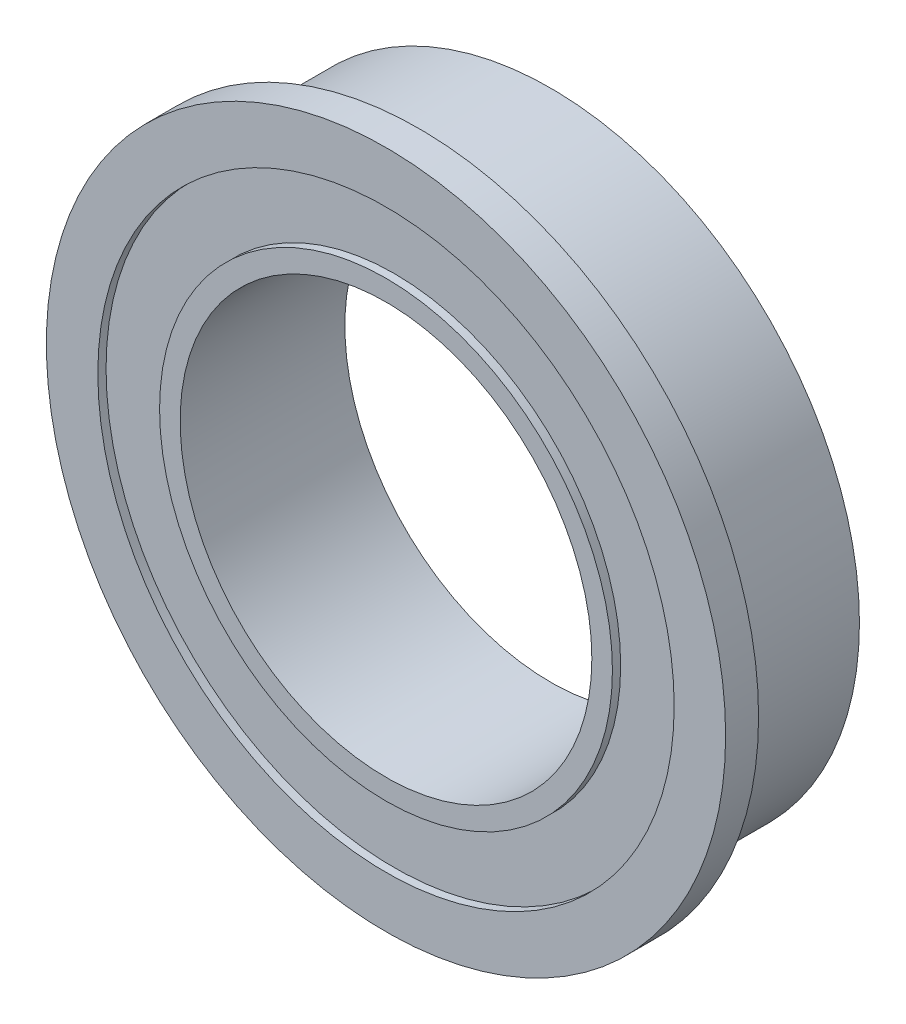
ISO-10303-21;
HEADER;
FILE_DESCRIPTION(('STEP AP214'),'2;1');
FILE_NAME('part.step','',(''),(''),'','','');
FILE_SCHEMA(('AUTOMOTIVE_DESIGN { 1 0 10303 214 1 1 1 1 }'));
ENDSEC;
DATA;
#1=APPLICATION_CONTEXT('core data for automotive mechanical design processes');
#2=APPLICATION_PROTOCOL_DEFINITION('international standard','automotive_design',2000,#1);
#3=PRODUCT_CONTEXT('',#1,'mechanical');
#4=PRODUCT('Part','Part','',(#3));
#5=PRODUCT_RELATED_PRODUCT_CATEGORY('part','',(#4));
#6=PRODUCT_DEFINITION_FORMATION('','',#4);
#7=PRODUCT_DEFINITION_CONTEXT('part definition',#1,'design');
#8=PRODUCT_DEFINITION('design','',#6,#7);
#9=PRODUCT_DEFINITION_SHAPE('','',#8);
#10=(LENGTH_UNIT() NAMED_UNIT(*) SI_UNIT(.MILLI.,.METRE.));
#11=(NAMED_UNIT(*) PLANE_ANGLE_UNIT() SI_UNIT($,.RADIAN.));
#12=(NAMED_UNIT(*) SI_UNIT($,.STERADIAN.) SOLID_ANGLE_UNIT());
#13=UNCERTAINTY_MEASURE_WITH_UNIT(LENGTH_MEASURE(1.E-05),#10,'distance_accuracy_value','');
#14=(GEOMETRIC_REPRESENTATION_CONTEXT(3) GLOBAL_UNCERTAINTY_ASSIGNED_CONTEXT((#13)) GLOBAL_UNIT_ASSIGNED_CONTEXT((#10,
#11,#12)) REPRESENTATION_CONTEXT('',''));
#15=CARTESIAN_POINT('',(0.,0.,0.));
#16=DIRECTION('',(0.,0.,1.));
#17=DIRECTION('',(1.,0.,0.));
#18=AXIS2_PLACEMENT_3D('',#15,#16,#17);
#19=CARTESIAN_POINT('',(0.,0.,0.8));
#20=DIRECTION('',(0.,0.,1.));
#21=DIRECTION('',(1.,0.,0.));
#22=AXIS2_PLACEMENT_3D('',#19,#20,#21);
#23=PLANE('',#22);
#24=CARTESIAN_POINT('',(0.,0.,0.8));
#25=DIRECTION('',(0.,0.,1.));
#26=DIRECTION('',(1.,0.,0.));
#27=AXIS2_PLACEMENT_3D('',#24,#25,#26);
#28=CIRCLE('',#27,5.);
#29=CARTESIAN_POINT('',(5.,0.,0.8));
#30=VERTEX_POINT('',#29);
#31=EDGE_CURVE('E53',#30,#30,#28,.T.);
#32=ORIENTED_EDGE('',*,*,#31,.F.);
#33=EDGE_LOOP('',(#32));
#34=FACE_BOUND('',#33,.T.);
#35=CARTESIAN_POINT('',(0.,0.,0.8));
#36=DIRECTION('',(0.,0.,-1.));
#37=DIRECTION('',(-1.,0.,0.));
#38=AXIS2_PLACEMENT_3D('',#35,#36,#37);
#39=CIRCLE('',#38,5.5);
#40=CARTESIAN_POINT('',(-5.5,0.,0.8));
#41=VERTEX_POINT('',#40);
#42=EDGE_CURVE('E77',#41,#41,#39,.T.);
#43=ORIENTED_EDGE('',*,*,#42,.F.);
#44=EDGE_LOOP('',(#43));
#45=FACE_BOUND('',#44,.T.);
#46=ADVANCED_FACE('F34',(#34,#45),#23,.T.);
#47=CARTESIAN_POINT('',(0.,0.,-3.2));
#48=DIRECTION('',(0.,0.,1.));
#49=DIRECTION('',(1.,0.,0.));
#50=AXIS2_PLACEMENT_3D('',#47,#48,#49);
#51=PLANE('',#50);
#52=CARTESIAN_POINT('',(0.,0.,-3.2));
#53=DIRECTION('',(0.,0.,1.));
#54=DIRECTION('',(1.,0.,0.));
#55=AXIS2_PLACEMENT_3D('',#52,#53,#54);
#56=CIRCLE('',#55,5.);
#57=CARTESIAN_POINT('',(5.,0.,-3.2));
#58=VERTEX_POINT('',#57);
#59=EDGE_CURVE('E52',#58,#58,#56,.T.);
#60=ORIENTED_EDGE('',*,*,#59,.T.);
#61=EDGE_LOOP('',(#60));
#62=FACE_BOUND('',#61,.T.);
#63=CARTESIAN_POINT('',(0.,0.,-3.2));
#64=DIRECTION('',(0.,0.,-1.));
#65=DIRECTION('',(-1.,0.,0.));
#66=AXIS2_PLACEMENT_3D('',#63,#64,#65);
#67=CIRCLE('',#66,5.5);
#68=CARTESIAN_POINT('',(-5.5,0.,-3.2));
#69=VERTEX_POINT('',#68);
#70=EDGE_CURVE('E65',#69,#69,#67,.T.);
#71=ORIENTED_EDGE('',*,*,#70,.T.);
#72=EDGE_LOOP('',(#71));
#73=FACE_BOUND('',#72,.T.);
#74=ADVANCED_FACE('F93',(#62,#73),#51,.F.);
#75=CARTESIAN_POINT('',(0.,0.,0.8));
#76=DIRECTION('',(0.,0.,-1.));
#77=DIRECTION('',(-1.,0.,0.));
#78=AXIS2_PLACEMENT_3D('',#75,#76,#77);
#79=CIRCLE('',#78,7.);
#80=CARTESIAN_POINT('',(-7.,0.,0.8));
#81=VERTEX_POINT('',#80);
#82=EDGE_CURVE('E71',#81,#81,#79,.T.);
#83=ORIENTED_EDGE('',*,*,#82,.T.);
#84=EDGE_LOOP('',(#83));
#85=FACE_BOUND('',#84,.T.);
#86=CARTESIAN_POINT('',(0.,0.,0.8));
#87=DIRECTION('',(0.,0.,1.));
#88=DIRECTION('',(1.,0.,0.));
#89=AXIS2_PLACEMENT_3D('',#86,#87,#88);
#90=CIRCLE('',#89,8.25);
#91=CARTESIAN_POINT('',(8.25,0.,0.8));
#92=VERTEX_POINT('',#91);
#93=EDGE_CURVE('E10',#92,#92,#90,.T.);
#94=ORIENTED_EDGE('',*,*,#93,.T.);
#95=EDGE_LOOP('',(#94));
#96=FACE_BOUND('',#95,.T.);
#97=ADVANCED_FACE('F96',(#85,#96),#23,.T.);
#98=CARTESIAN_POINT('',(0.,0.,0.));
#99=DIRECTION('',(0.,0.,1.));
#100=DIRECTION('',(1.,0.,0.));
#101=AXIS2_PLACEMENT_3D('',#98,#99,#100);
#102=PLANE('',#101);
#103=CARTESIAN_POINT('',(0.,0.,0.));
#104=DIRECTION('',(0.,0.,1.));
#105=DIRECTION('',(1.,0.,0.));
#106=AXIS2_PLACEMENT_3D('',#103,#104,#105);
#107=CIRCLE('',#106,8.25);
#108=CARTESIAN_POINT('',(8.25,0.,0.));
#109=VERTEX_POINT('',#108);
#110=EDGE_CURVE('E38',#109,#109,#107,.T.);
#111=ORIENTED_EDGE('',*,*,#110,.F.);
#112=EDGE_LOOP('',(#111));
#113=FACE_BOUND('',#112,.T.);
#114=CARTESIAN_POINT('',(0.,0.,0.));
#115=DIRECTION('',(0.,0.,1.));
#116=DIRECTION('',(1.,0.,0.));
#117=AXIS2_PLACEMENT_3D('',#114,#115,#116);
#118=CIRCLE('',#117,7.5);
#119=CARTESIAN_POINT('',(7.5,0.,0.));
#120=VERTEX_POINT('',#119);
#121=EDGE_CURVE('E45',#120,#120,#118,.T.);
#122=ORIENTED_EDGE('',*,*,#121,.T.);
#123=EDGE_LOOP('',(#122));
#124=FACE_BOUND('',#123,.T.);
#125=ADVANCED_FACE('F106',(#113,#124),#102,.F.);
#126=CARTESIAN_POINT('',(0.,0.,0.8));
#127=DIRECTION('',(0.,0.,-1.));
#128=DIRECTION('',(-1.,0.,0.));
#129=AXIS2_PLACEMENT_3D('',#126,#127,#128);
#130=CYLINDRICAL_SURFACE('',#129,8.25);
#131=ORIENTED_EDGE('',*,*,#93,.F.);
#132=EDGE_LOOP('',(#131));
#133=FACE_BOUND('',#132,.T.);
#134=ORIENTED_EDGE('',*,*,#110,.T.);
#135=EDGE_LOOP('',(#134));
#136=FACE_BOUND('',#135,.T.);
#137=ADVANCED_FACE('F36',(#133,#136),#130,.T.);
#138=CARTESIAN_POINT('',(0.,0.,-3.2));
#139=DIRECTION('',(0.,0.,1.));
#140=DIRECTION('',(1.,0.,0.));
#141=AXIS2_PLACEMENT_3D('',#138,#139,#140);
#142=CYLINDRICAL_SURFACE('',#141,7.5);
#143=CARTESIAN_POINT('',(0.,0.,-3.2));
#144=DIRECTION('',(0.,0.,1.));
#145=DIRECTION('',(1.,0.,0.));
#146=AXIS2_PLACEMENT_3D('',#143,#144,#145);
#147=CIRCLE('',#146,7.5);
#148=CARTESIAN_POINT('',(7.5,0.,-3.2));
#149=VERTEX_POINT('',#148);
#150=EDGE_CURVE('E49',#149,#149,#147,.T.);
#151=ORIENTED_EDGE('',*,*,#150,.T.);
#152=EDGE_LOOP('',(#151));
#153=FACE_BOUND('',#152,.T.);
#154=ORIENTED_EDGE('',*,*,#121,.F.);
#155=EDGE_LOOP('',(#154));
#156=FACE_BOUND('',#155,.T.);
#157=ADVANCED_FACE('F139',(#153,#156),#142,.T.);
#158=CARTESIAN_POINT('',(0.,0.,-3.2));
#159=DIRECTION('',(0.,0.,-1.));
#160=DIRECTION('',(-1.,0.,0.));
#161=AXIS2_PLACEMENT_3D('',#158,#159,#160);
#162=CIRCLE('',#161,7.);
#163=CARTESIAN_POINT('',(-7.,0.,-3.2));
#164=VERTEX_POINT('',#163);
#165=EDGE_CURVE('E59',#164,#164,#162,.T.);
#166=ORIENTED_EDGE('',*,*,#165,.F.);
#167=EDGE_LOOP('',(#166));
#168=FACE_BOUND('',#167,.T.);
#169=ORIENTED_EDGE('',*,*,#150,.F.);
#170=EDGE_LOOP('',(#169));
#171=FACE_BOUND('',#170,.T.);
#172=ADVANCED_FACE('F102',(#168,#171),#51,.F.);
#173=CARTESIAN_POINT('',(0.,0.,-3.2));
#174=DIRECTION('',(0.,0.,1.));
#175=DIRECTION('',(1.,0.,0.));
#176=AXIS2_PLACEMENT_3D('',#173,#174,#175);
#177=CYLINDRICAL_SURFACE('',#176,5.);
#178=ORIENTED_EDGE('',*,*,#59,.F.);
#179=EDGE_LOOP('',(#178));
#180=FACE_BOUND('',#179,.T.);
#181=ORIENTED_EDGE('',*,*,#31,.T.);
#182=EDGE_LOOP('',(#181));
#183=FACE_BOUND('',#182,.T.);
#184=ADVANCED_FACE('F134',(#180,#183),#177,.F.);
#185=CARTESIAN_POINT('',(0.,0.,-3.));
#186=DIRECTION('',(0.,0.,-1.));
#187=DIRECTION('',(-1.,0.,0.));
#188=AXIS2_PLACEMENT_3D('',#185,#186,#187);
#189=CYLINDRICAL_SURFACE('',#188,7.);
#190=CARTESIAN_POINT('',(0.,0.,-3.));
#191=DIRECTION('',(0.,0.,-1.));
#192=DIRECTION('',(-1.,0.,0.));
#193=AXIS2_PLACEMENT_3D('',#190,#191,#192);
#194=CIRCLE('',#193,7.);
#195=CARTESIAN_POINT('',(-7.,0.,-3.));
#196=VERTEX_POINT('',#195);
#197=EDGE_CURVE('E56',#196,#196,#194,.T.);
#198=ORIENTED_EDGE('',*,*,#197,.F.);
#199=EDGE_LOOP('',(#198));
#200=FACE_BOUND('',#199,.T.);
#201=ORIENTED_EDGE('',*,*,#165,.T.);
#202=EDGE_LOOP('',(#201));
#203=FACE_BOUND('',#202,.T.);
#204=ADVANCED_FACE('F130',(#200,#203),#189,.F.);
#205=CARTESIAN_POINT('',(0.,0.,-3.));
#206=DIRECTION('',(0.,0.,-1.));
#207=DIRECTION('',(-1.,0.,0.));
#208=AXIS2_PLACEMENT_3D('',#205,#206,#207);
#209=PLANE('',#208);
#210=CARTESIAN_POINT('',(0.,0.,-3.));
#211=DIRECTION('',(0.,0.,-1.));
#212=DIRECTION('',(-1.,0.,0.));
#213=AXIS2_PLACEMENT_3D('',#210,#211,#212);
#214=CIRCLE('',#213,5.5);
#215=CARTESIAN_POINT('',(-5.5,0.,-3.));
#216=VERTEX_POINT('',#215);
#217=EDGE_CURVE('E62',#216,#216,#214,.T.);
#218=ORIENTED_EDGE('',*,*,#217,.F.);
#219=EDGE_LOOP('',(#218));
#220=FACE_BOUND('',#219,.T.);
#221=ORIENTED_EDGE('',*,*,#197,.T.);
#222=EDGE_LOOP('',(#221));
#223=FACE_BOUND('',#222,.T.);
#224=ADVANCED_FACE('F126',(#220,#223),#209,.T.);
#225=CARTESIAN_POINT('',(0.,0.,-3.));
#226=DIRECTION('',(0.,0.,-1.));
#227=DIRECTION('',(-1.,0.,0.));
#228=AXIS2_PLACEMENT_3D('',#225,#226,#227);
#229=CYLINDRICAL_SURFACE('',#228,5.5);
#230=ORIENTED_EDGE('',*,*,#217,.T.);
#231=EDGE_LOOP('',(#230));
#232=FACE_BOUND('',#231,.T.);
#233=ORIENTED_EDGE('',*,*,#70,.F.);
#234=EDGE_LOOP('',(#233));
#235=FACE_BOUND('',#234,.T.);
#236=ADVANCED_FACE('F120',(#232,#235),#229,.T.);
#237=CARTESIAN_POINT('',(0.,0.,0.6));
#238=DIRECTION('',(0.,0.,1.));
#239=DIRECTION('',(-1.,0.,0.));
#240=AXIS2_PLACEMENT_3D('',#237,#238,#239);
#241=PLANE('',#240);
#242=CARTESIAN_POINT('',(0.,0.,0.6));
#243=DIRECTION('',(0.,0.,-1.));
#244=DIRECTION('',(-1.,0.,0.));
#245=AXIS2_PLACEMENT_3D('',#242,#243,#244);
#246=CIRCLE('',#245,7.);
#247=CARTESIAN_POINT('',(-7.,0.,0.6));
#248=VERTEX_POINT('',#247);
#249=EDGE_CURVE('E68',#248,#248,#246,.T.);
#250=ORIENTED_EDGE('',*,*,#249,.F.);
#251=EDGE_LOOP('',(#250));
#252=FACE_BOUND('',#251,.T.);
#253=CARTESIAN_POINT('',(0.,0.,0.6));
#254=DIRECTION('',(0.,0.,-1.));
#255=DIRECTION('',(-1.,0.,0.));
#256=AXIS2_PLACEMENT_3D('',#253,#254,#255);
#257=CIRCLE('',#256,5.5);
#258=CARTESIAN_POINT('',(-5.5,0.,0.6));
#259=VERTEX_POINT('',#258);
#260=EDGE_CURVE('E74',#259,#259,#257,.T.);
#261=ORIENTED_EDGE('',*,*,#260,.T.);
#262=EDGE_LOOP('',(#261));
#263=FACE_BOUND('',#262,.T.);
#264=ADVANCED_FACE('F83',(#252,#263),#241,.T.);
#265=CARTESIAN_POINT('',(0.,0.,0.6));
#266=DIRECTION('',(0.,0.,1.));
#267=DIRECTION('',(1.,0.,0.));
#268=AXIS2_PLACEMENT_3D('',#265,#266,#267);
#269=CYLINDRICAL_SURFACE('',#268,7.);
#270=ORIENTED_EDGE('',*,*,#249,.T.);
#271=EDGE_LOOP('',(#270));
#272=FACE_BOUND('',#271,.T.);
#273=ORIENTED_EDGE('',*,*,#82,.F.);
#274=EDGE_LOOP('',(#273));
#275=FACE_BOUND('',#274,.T.);
#276=ADVANCED_FACE('F88',(#272,#275),#269,.F.);
#277=CARTESIAN_POINT('',(0.,0.,0.6));
#278=DIRECTION('',(0.,0.,1.));
#279=DIRECTION('',(1.,0.,0.));
#280=AXIS2_PLACEMENT_3D('',#277,#278,#279);
#281=CYLINDRICAL_SURFACE('',#280,5.5);
#282=ORIENTED_EDGE('',*,*,#260,.F.);
#283=EDGE_LOOP('',(#282));
#284=FACE_BOUND('',#283,.T.);
#285=ORIENTED_EDGE('',*,*,#42,.T.);
#286=EDGE_LOOP('',(#285));
#287=FACE_BOUND('',#286,.T.);
#288=ADVANCED_FACE('F85',(#284,#287),#281,.T.);
#289=CLOSED_SHELL('',(#46,#74,#97,#125,#137,#157,#172,#184,#204,#224,#236,#264,#276,#288));
#290=MANIFOLD_SOLID_BREP('B2',#289);
#291=ADVANCED_BREP_SHAPE_REPRESENTATION('',(#18,#290),#14);
#292=SHAPE_DEFINITION_REPRESENTATION(#9,#291);
ENDSEC;
END-ISO-10303-21;
